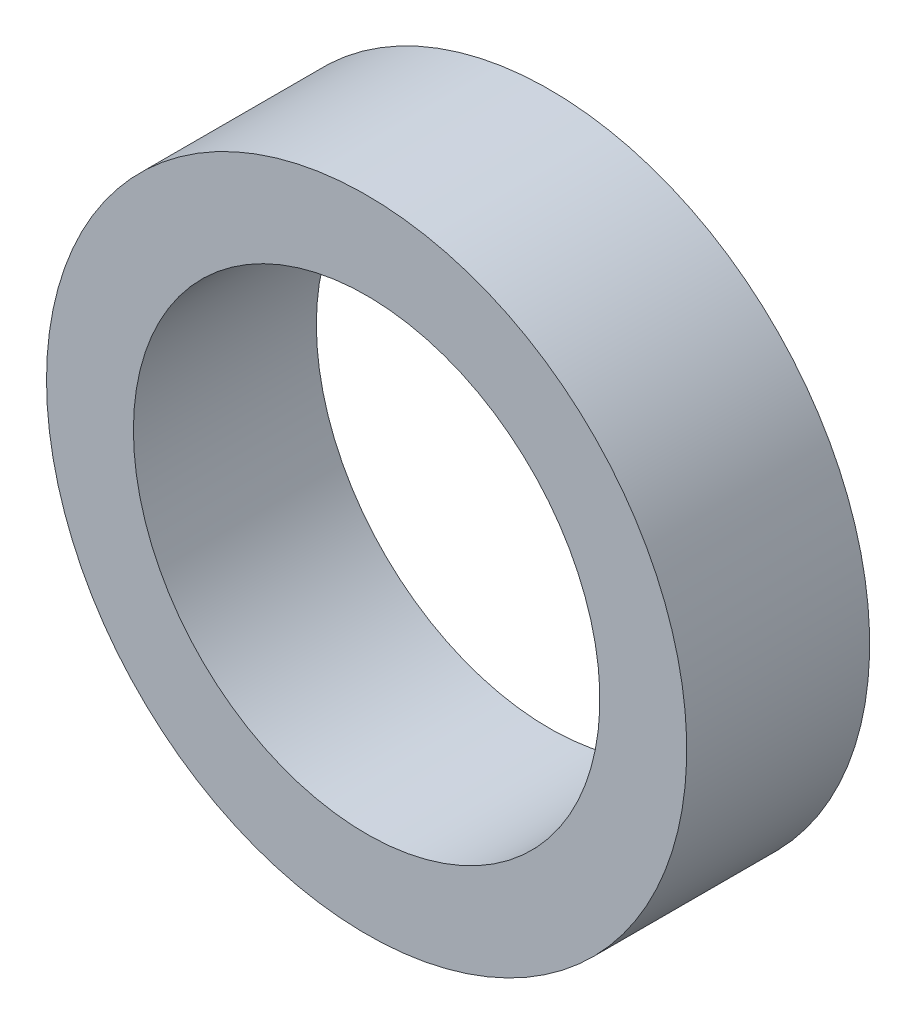
ISO-10303-21;
HEADER;
FILE_DESCRIPTION(('STEP AP214'),'2;1');
FILE_NAME('part.step','',(''),(''),'','','');
FILE_SCHEMA(('AUTOMOTIVE_DESIGN { 1 0 10303 214 1 1 1 1 }'));
ENDSEC;
DATA;
#1=APPLICATION_CONTEXT('core data for automotive mechanical design processes');
#2=APPLICATION_PROTOCOL_DEFINITION('international standard','automotive_design',2000,#1);
#3=PRODUCT_CONTEXT('',#1,'mechanical');
#4=PRODUCT('Part','Part','',(#3));
#5=PRODUCT_RELATED_PRODUCT_CATEGORY('part','',(#4));
#6=PRODUCT_DEFINITION_FORMATION('','',#4);
#7=PRODUCT_DEFINITION_CONTEXT('part definition',#1,'design');
#8=PRODUCT_DEFINITION('design','',#6,#7);
#9=PRODUCT_DEFINITION_SHAPE('','',#8);
#10=(LENGTH_UNIT() NAMED_UNIT(*) SI_UNIT(.MILLI.,.METRE.));
#11=(NAMED_UNIT(*) PLANE_ANGLE_UNIT() SI_UNIT($,.RADIAN.));
#12=(NAMED_UNIT(*) SI_UNIT($,.STERADIAN.) SOLID_ANGLE_UNIT());
#13=UNCERTAINTY_MEASURE_WITH_UNIT(LENGTH_MEASURE(1.E-05),#10,'distance_accuracy_value','');
#14=(GEOMETRIC_REPRESENTATION_CONTEXT(3) GLOBAL_UNCERTAINTY_ASSIGNED_CONTEXT((#13)) GLOBAL_UNIT_ASSIGNED_CONTEXT((#10,
#11,#12)) REPRESENTATION_CONTEXT('',''));
#15=CARTESIAN_POINT('',(0.,0.,0.));
#16=DIRECTION('',(0.,0.,1.));
#17=DIRECTION('',(1.,0.,0.));
#18=AXIS2_PLACEMENT_3D('',#15,#16,#17);
#19=CARTESIAN_POINT('',(0.,0.,4.));
#20=DIRECTION('',(0.,0.,-1.));
#21=DIRECTION('',(-1.,0.,0.));
#22=AXIS2_PLACEMENT_3D('',#19,#20,#21);
#23=CYLINDRICAL_SURFACE('',#22,5.1);
#24=CARTESIAN_POINT('',(0.,0.,0.));
#25=DIRECTION('',(0.,0.,-1.));
#26=DIRECTION('',(-1.,0.,0.));
#27=AXIS2_PLACEMENT_3D('',#24,#25,#26);
#28=CIRCLE('',#27,5.1);
#29=CARTESIAN_POINT('',(-5.1,0.,0.));
#30=VERTEX_POINT('',#29);
#31=EDGE_CURVE('E27',#30,#30,#28,.T.);
#32=ORIENTED_EDGE('',*,*,#31,.T.);
#33=EDGE_LOOP('',(#32));
#34=FACE_BOUND('',#33,.T.);
#35=CARTESIAN_POINT('',(0.,0.,4.));
#36=DIRECTION('',(0.,0.,-1.));
#37=DIRECTION('',(-1.,0.,0.));
#38=AXIS2_PLACEMENT_3D('',#35,#36,#37);
#39=CIRCLE('',#38,5.1);
#40=CARTESIAN_POINT('',(-5.1,0.,4.));
#41=VERTEX_POINT('',#40);
#42=EDGE_CURVE('E18',#41,#41,#39,.T.);
#43=ORIENTED_EDGE('',*,*,#42,.F.);
#44=EDGE_LOOP('',(#43));
#45=FACE_BOUND('',#44,.T.);
#46=ADVANCED_FACE('F15',(#34,#45),#23,.F.);
#47=CARTESIAN_POINT('',(0.,0.,4.));
#48=DIRECTION('',(0.,0.,1.));
#49=DIRECTION('',(1.,0.,0.));
#50=AXIS2_PLACEMENT_3D('',#47,#48,#49);
#51=PLANE('',#50);
#52=ORIENTED_EDGE('',*,*,#42,.T.);
#53=EDGE_LOOP('',(#52));
#54=FACE_BOUND('',#53,.T.);
#55=CARTESIAN_POINT('',(0.,0.,4.));
#56=DIRECTION('',(0.,0.,-1.));
#57=DIRECTION('',(-1.,0.,0.));
#58=AXIS2_PLACEMENT_3D('',#55,#56,#57);
#59=CIRCLE('',#58,7.);
#60=CARTESIAN_POINT('',(-7.,0.,4.));
#61=VERTEX_POINT('',#60);
#62=EDGE_CURVE('E22',#61,#61,#59,.T.);
#63=ORIENTED_EDGE('',*,*,#62,.F.);
#64=EDGE_LOOP('',(#63));
#65=FACE_BOUND('',#64,.T.);
#66=ADVANCED_FACE('F35',(#54,#65),#51,.T.);
#67=CARTESIAN_POINT('',(0.,0.,0.));
#68=DIRECTION('',(0.,0.,1.));
#69=DIRECTION('',(1.,0.,0.));
#70=AXIS2_PLACEMENT_3D('',#67,#68,#69);
#71=PLANE('',#70);
#72=ORIENTED_EDGE('',*,*,#31,.F.);
#73=EDGE_LOOP('',(#72));
#74=FACE_BOUND('',#73,.T.);
#75=CARTESIAN_POINT('',(0.,0.,0.));
#76=DIRECTION('',(0.,0.,-1.));
#77=DIRECTION('',(-1.,0.,0.));
#78=AXIS2_PLACEMENT_3D('',#75,#76,#77);
#79=CIRCLE('',#78,7.);
#80=CARTESIAN_POINT('',(-7.,0.,0.));
#81=VERTEX_POINT('',#80);
#82=EDGE_CURVE('E10',#81,#81,#79,.F.);
#83=ORIENTED_EDGE('',*,*,#82,.F.);
#84=EDGE_LOOP('',(#83));
#85=FACE_BOUND('',#84,.T.);
#86=ADVANCED_FACE('F43',(#74,#85),#71,.F.);
#87=CARTESIAN_POINT('',(0.,0.,4.));
#88=DIRECTION('',(0.,0.,-1.));
#89=DIRECTION('',(-1.,0.,0.));
#90=AXIS2_PLACEMENT_3D('',#87,#88,#89);
#91=CYLINDRICAL_SURFACE('',#90,7.);
#92=ORIENTED_EDGE('',*,*,#82,.T.);
#93=EDGE_LOOP('',(#92));
#94=FACE_BOUND('',#93,.T.);
#95=ORIENTED_EDGE('',*,*,#62,.T.);
#96=EDGE_LOOP('',(#95));
#97=FACE_BOUND('',#96,.T.);
#98=ADVANCED_FACE('F44',(#94,#97),#91,.T.);
#99=CLOSED_SHELL('',(#46,#66,#86,#98));
#100=MANIFOLD_SOLID_BREP('B1',#99);
#101=ADVANCED_BREP_SHAPE_REPRESENTATION('',(#18,#100),#14);
#102=SHAPE_DEFINITION_REPRESENTATION(#9,#101);
ENDSEC;
END-ISO-10303-21;
